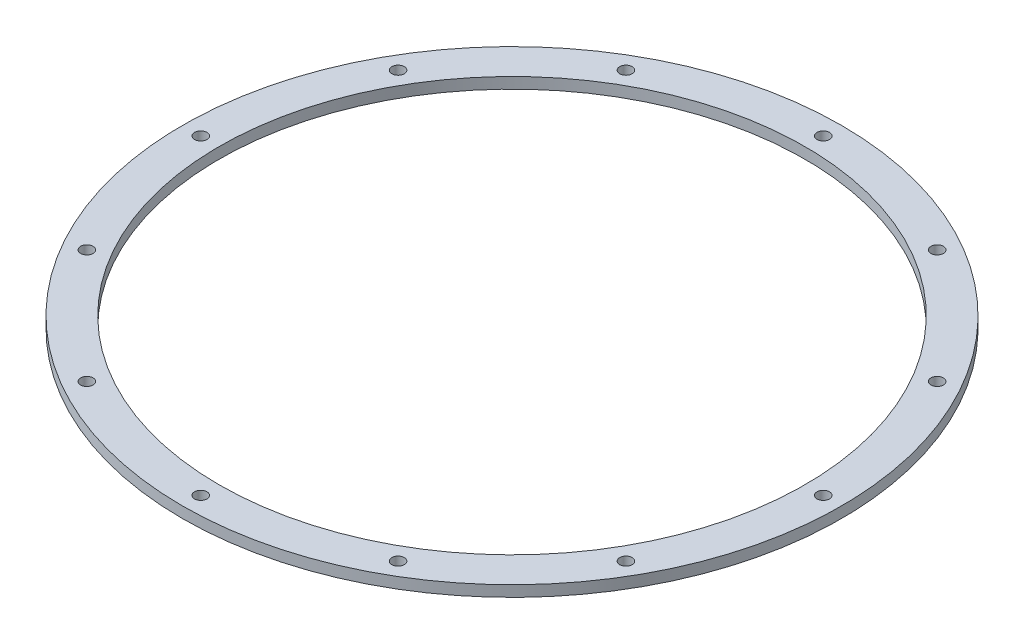
ISO-10303-21;
HEADER;
FILE_DESCRIPTION(('STEP AP214'),'2;1');
FILE_NAME('part.step','',(''),(''),'','','');
FILE_SCHEMA(('AUTOMOTIVE_DESIGN { 1 0 10303 214 1 1 1 1 }'));
ENDSEC;
DATA;
#1=APPLICATION_CONTEXT('core data for automotive mechanical design processes');
#2=APPLICATION_PROTOCOL_DEFINITION('international standard','automotive_design',2000,#1);
#3=PRODUCT_CONTEXT('',#1,'mechanical');
#4=PRODUCT('Part','Part','',(#3));
#5=PRODUCT_RELATED_PRODUCT_CATEGORY('part','',(#4));
#6=PRODUCT_DEFINITION_FORMATION('','',#4);
#7=PRODUCT_DEFINITION_CONTEXT('part definition',#1,'design');
#8=PRODUCT_DEFINITION('design','',#6,#7);
#9=PRODUCT_DEFINITION_SHAPE('','',#8);
#10=(LENGTH_UNIT() NAMED_UNIT(*) SI_UNIT(.MILLI.,.METRE.));
#11=(NAMED_UNIT(*) PLANE_ANGLE_UNIT() SI_UNIT($,.RADIAN.));
#12=(NAMED_UNIT(*) SI_UNIT($,.STERADIAN.) SOLID_ANGLE_UNIT());
#13=UNCERTAINTY_MEASURE_WITH_UNIT(LENGTH_MEASURE(1.E-05),#10,'distance_accuracy_value','');
#14=(GEOMETRIC_REPRESENTATION_CONTEXT(3) GLOBAL_UNCERTAINTY_ASSIGNED_CONTEXT((#13)) GLOBAL_UNIT_ASSIGNED_CONTEXT((#10,
#11,#12)) REPRESENTATION_CONTEXT('',''));
#15=CARTESIAN_POINT('',(0.,0.,0.));
#16=DIRECTION('',(0.,0.,1.));
#17=DIRECTION('',(1.,0.,0.));
#18=AXIS2_PLACEMENT_3D('',#15,#16,#17);
#19=CARTESIAN_POINT('',(0.,3.,0.));
#20=DIRECTION('',(0.,-1.,0.));
#21=DIRECTION('',(0.,0.,-1.));
#22=AXIS2_PLACEMENT_3D('',#19,#20,#21);
#23=CYLINDRICAL_SURFACE('',#22,80.);
#24=CARTESIAN_POINT('',(0.,3.,0.));
#25=DIRECTION('',(0.,1.,0.));
#26=DIRECTION('',(0.,0.,1.));
#27=AXIS2_PLACEMENT_3D('',#24,#25,#26);
#28=CIRCLE('',#27,80.);
#29=CARTESIAN_POINT('',(0.,3.,80.));
#30=VERTEX_POINT('',#29);
#31=EDGE_CURVE('E48',#30,#30,#28,.T.);
#32=ORIENTED_EDGE('',*,*,#31,.T.);
#33=EDGE_LOOP('',(#32));
#34=FACE_BOUND('',#33,.T.);
#35=CARTESIAN_POINT('',(0.,0.,0.));
#36=DIRECTION('',(0.,1.,0.));
#37=DIRECTION('',(0.,0.,1.));
#38=AXIS2_PLACEMENT_3D('',#35,#36,#37);
#39=CIRCLE('',#38,80.);
#40=CARTESIAN_POINT('',(0.,0.,80.));
#41=VERTEX_POINT('',#40);
#42=EDGE_CURVE('E105',#41,#41,#39,.T.);
#43=ORIENTED_EDGE('',*,*,#42,.F.);
#44=EDGE_LOOP('',(#43));
#45=FACE_BOUND('',#44,.T.);
#46=ADVANCED_FACE('F39',(#34,#45),#23,.F.);
#47=CARTESIAN_POINT('',(0.,3.,-85.));
#48=DIRECTION('',(0.,-1.,0.));
#49=DIRECTION('',(0.,0.,-1.));
#50=AXIS2_PLACEMENT_3D('',#47,#48,#49);
#51=CYLINDRICAL_SURFACE('',#50,1.7);
#52=CARTESIAN_POINT('',(0.,3.,-85.));
#53=DIRECTION('',(0.,1.,0.));
#54=DIRECTION('',(0.,0.,1.));
#55=AXIS2_PLACEMENT_3D('',#52,#53,#54);
#56=CIRCLE('',#55,1.7);
#57=CARTESIAN_POINT('',(0.,3.,-83.3));
#58=VERTEX_POINT('',#57);
#59=EDGE_CURVE('E54',#58,#58,#56,.T.);
#60=ORIENTED_EDGE('',*,*,#59,.T.);
#61=EDGE_LOOP('',(#60));
#62=FACE_BOUND('',#61,.T.);
#63=CARTESIAN_POINT('',(0.,0.,-85.));
#64=DIRECTION('',(0.,1.,0.));
#65=DIRECTION('',(0.,0.,1.));
#66=AXIS2_PLACEMENT_3D('',#63,#64,#65);
#67=CIRCLE('',#66,1.7);
#68=CARTESIAN_POINT('',(0.,0.,-83.3));
#69=VERTEX_POINT('',#68);
#70=EDGE_CURVE('E102',#69,#69,#67,.T.);
#71=ORIENTED_EDGE('',*,*,#70,.F.);
#72=EDGE_LOOP('',(#71));
#73=FACE_BOUND('',#72,.T.);
#74=ADVANCED_FACE('F164',(#62,#73),#51,.F.);
#75=CARTESIAN_POINT('',(42.5000000000001,3.,-73.6121593216773));
#76=DIRECTION('',(0.,-1.,0.));
#77=DIRECTION('',(0.,0.,-1.));
#78=AXIS2_PLACEMENT_3D('',#75,#76,#77);
#79=CYLINDRICAL_SURFACE('',#78,1.7);
#80=CARTESIAN_POINT('',(42.5000000000001,3.,-73.6121593216773));
#81=DIRECTION('',(0.,1.,0.));
#82=DIRECTION('',(0.,0.,1.));
#83=AXIS2_PLACEMENT_3D('',#80,#81,#82);
#84=CIRCLE('',#83,1.7);
#85=CARTESIAN_POINT('',(42.5000000000001,3.,-71.9121593216772));
#86=VERTEX_POINT('',#85);
#87=EDGE_CURVE('E157',#86,#86,#84,.T.);
#88=ORIENTED_EDGE('',*,*,#87,.T.);
#89=EDGE_LOOP('',(#88));
#90=FACE_BOUND('',#89,.T.);
#91=CARTESIAN_POINT('',(42.5000000000001,0.,-73.6121593216773));
#92=DIRECTION('',(0.,1.,0.));
#93=DIRECTION('',(0.,0.,1.));
#94=AXIS2_PLACEMENT_3D('',#91,#92,#93);
#95=CIRCLE('',#94,1.7);
#96=CARTESIAN_POINT('',(42.5000000000001,0.,-71.9121593216772));
#97=VERTEX_POINT('',#96);
#98=EDGE_CURVE('E98',#97,#97,#95,.T.);
#99=ORIENTED_EDGE('',*,*,#98,.F.);
#100=EDGE_LOOP('',(#99));
#101=FACE_BOUND('',#100,.T.);
#102=ADVANCED_FACE('F182',(#90,#101),#79,.F.);
#103=CARTESIAN_POINT('',(73.6121593216791,3.,-42.5000000000031));
#104=DIRECTION('',(0.,-1.,0.));
#105=DIRECTION('',(0.,0.,-1.));
#106=AXIS2_PLACEMENT_3D('',#103,#104,#105);
#107=CYLINDRICAL_SURFACE('',#106,1.70000000000101);
#108=CARTESIAN_POINT('',(73.6121593216791,3.,-42.5000000000031));
#109=DIRECTION('',(0.,1.,0.));
#110=DIRECTION('',(0.,0.,1.));
#111=AXIS2_PLACEMENT_3D('',#108,#109,#110);
#112=CIRCLE('',#111,1.70000000000101);
#113=CARTESIAN_POINT('',(73.6121593216791,3.,-40.8000000000021));
#114=VERTEX_POINT('',#113);
#115=EDGE_CURVE('E153',#114,#114,#112,.T.);
#116=ORIENTED_EDGE('',*,*,#115,.T.);
#117=EDGE_LOOP('',(#116));
#118=FACE_BOUND('',#117,.T.);
#119=CARTESIAN_POINT('',(73.6121593216791,0.,-42.5000000000031));
#120=DIRECTION('',(0.,1.,0.));
#121=DIRECTION('',(0.,0.,1.));
#122=AXIS2_PLACEMENT_3D('',#119,#120,#121);
#123=CIRCLE('',#122,1.70000000000101);
#124=CARTESIAN_POINT('',(73.6121593216791,0.,-40.8000000000021));
#125=VERTEX_POINT('',#124);
#126=EDGE_CURVE('E94',#125,#125,#123,.T.);
#127=ORIENTED_EDGE('',*,*,#126,.F.);
#128=EDGE_LOOP('',(#127));
#129=FACE_BOUND('',#128,.T.);
#130=ADVANCED_FACE('F189',(#118,#129),#107,.F.);
#131=CARTESIAN_POINT('',(85.0000000000036,3.,-3.60815370568738E-12));
#132=DIRECTION('',(0.,-1.,0.));
#133=DIRECTION('',(0.,0.,-1.));
#134=AXIS2_PLACEMENT_3D('',#131,#132,#133);
#135=CYLINDRICAL_SURFACE('',#134,1.70000000000269);
#136=CARTESIAN_POINT('',(85.0000000000036,3.,-3.60815370568738E-12));
#137=DIRECTION('',(0.,1.,0.));
#138=DIRECTION('',(0.,0.,1.));
#139=AXIS2_PLACEMENT_3D('',#136,#137,#138);
#140=CIRCLE('',#139,1.70000000000269);
#141=CARTESIAN_POINT('',(85.0000000000036,3.,1.69999999999908));
#142=VERTEX_POINT('',#141);
#143=EDGE_CURVE('E149',#142,#142,#140,.T.);
#144=ORIENTED_EDGE('',*,*,#143,.T.);
#145=EDGE_LOOP('',(#144));
#146=FACE_BOUND('',#145,.T.);
#147=CARTESIAN_POINT('',(85.0000000000036,0.,-3.60815370568738E-12));
#148=DIRECTION('',(0.,1.,0.));
#149=DIRECTION('',(0.,0.,1.));
#150=AXIS2_PLACEMENT_3D('',#147,#148,#149);
#151=CIRCLE('',#150,1.70000000000269);
#152=CARTESIAN_POINT('',(85.0000000000036,0.,1.69999999999908));
#153=VERTEX_POINT('',#152);
#154=EDGE_CURVE('E90',#153,#153,#151,.T.);
#155=ORIENTED_EDGE('',*,*,#154,.F.);
#156=EDGE_LOOP('',(#155));
#157=FACE_BOUND('',#156,.T.);
#158=ADVANCED_FACE('F193',(#146,#157),#135,.F.);
#159=CARTESIAN_POINT('',(73.6121593216827,3.,42.4999999999969));
#160=DIRECTION('',(0.,-1.,0.));
#161=DIRECTION('',(0.,0.,-1.));
#162=AXIS2_PLACEMENT_3D('',#159,#160,#161);
#163=CYLINDRICAL_SURFACE('',#162,1.70000000000466);
#164=CARTESIAN_POINT('',(73.6121593216827,3.,42.4999999999969));
#165=DIRECTION('',(0.,1.,0.));
#166=DIRECTION('',(0.,0.,1.));
#167=AXIS2_PLACEMENT_3D('',#164,#165,#166);
#168=CIRCLE('',#167,1.70000000000466);
#169=CARTESIAN_POINT('',(73.6121593216827,3.,44.2000000000015));
#170=VERTEX_POINT('',#169);
#171=EDGE_CURVE('E145',#170,#170,#168,.T.);
#172=ORIENTED_EDGE('',*,*,#171,.T.);
#173=EDGE_LOOP('',(#172));
#174=FACE_BOUND('',#173,.T.);
#175=CARTESIAN_POINT('',(73.6121593216827,0.,42.4999999999969));
#176=DIRECTION('',(0.,1.,0.));
#177=DIRECTION('',(0.,0.,1.));
#178=AXIS2_PLACEMENT_3D('',#175,#176,#177);
#179=CIRCLE('',#178,1.70000000000466);
#180=CARTESIAN_POINT('',(73.6121593216827,0.,44.2000000000015));
#181=VERTEX_POINT('',#180);
#182=EDGE_CURVE('E86',#181,#181,#179,.T.);
#183=ORIENTED_EDGE('',*,*,#182,.F.);
#184=EDGE_LOOP('',(#183));
#185=FACE_BOUND('',#184,.T.);
#186=ADVANCED_FACE('F197',(#174,#185),#163,.F.);
#187=CARTESIAN_POINT('',(42.5000000000068,3.,73.6121593216755));
#188=DIRECTION('',(0.,-1.,0.));
#189=DIRECTION('',(0.,0.,-1.));
#190=AXIS2_PLACEMENT_3D('',#187,#188,#189);
#191=CYLINDRICAL_SURFACE('',#190,1.70000000000642);
#192=CARTESIAN_POINT('',(42.5000000000068,3.,73.6121593216755));
#193=DIRECTION('',(0.,1.,0.));
#194=DIRECTION('',(0.,0.,1.));
#195=AXIS2_PLACEMENT_3D('',#192,#193,#194);
#196=CIRCLE('',#195,1.70000000000642);
#197=CARTESIAN_POINT('',(42.5000000000068,3.,75.3121593216819));
#198=VERTEX_POINT('',#197);
#199=EDGE_CURVE('E141',#198,#198,#196,.T.);
#200=ORIENTED_EDGE('',*,*,#199,.T.);
#201=EDGE_LOOP('',(#200));
#202=FACE_BOUND('',#201,.T.);
#203=CARTESIAN_POINT('',(42.5000000000068,0.,73.6121593216755));
#204=DIRECTION('',(0.,1.,0.));
#205=DIRECTION('',(0.,0.,1.));
#206=AXIS2_PLACEMENT_3D('',#203,#204,#205);
#207=CIRCLE('',#206,1.70000000000642);
#208=CARTESIAN_POINT('',(42.5000000000068,0.,75.3121593216819));
#209=VERTEX_POINT('',#208);
#210=EDGE_CURVE('E82',#209,#209,#207,.T.);
#211=ORIENTED_EDGE('',*,*,#210,.F.);
#212=EDGE_LOOP('',(#211));
#213=FACE_BOUND('',#212,.T.);
#214=ADVANCED_FACE('F201',(#202,#213),#191,.F.);
#215=CARTESIAN_POINT('',(7.21630741137477E-12,3.,85.));
#216=DIRECTION('',(0.,-1.,0.));
#217=DIRECTION('',(0.,0.,-1.));
#218=AXIS2_PLACEMENT_3D('',#215,#216,#217);
#219=CYLINDRICAL_SURFACE('',#218,1.70000000000747);
#220=CARTESIAN_POINT('',(7.21630741137477E-12,3.,85.));
#221=DIRECTION('',(0.,1.,0.));
#222=DIRECTION('',(0.,0.,1.));
#223=AXIS2_PLACEMENT_3D('',#220,#221,#222);
#224=CIRCLE('',#223,1.70000000000747);
#225=CARTESIAN_POINT('',(7.21630741137477E-12,3.,86.7000000000075));
#226=VERTEX_POINT('',#225);
#227=EDGE_CURVE('E137',#226,#226,#224,.T.);
#228=ORIENTED_EDGE('',*,*,#227,.T.);
#229=EDGE_LOOP('',(#228));
#230=FACE_BOUND('',#229,.T.);
#231=CARTESIAN_POINT('',(7.21630741137477E-12,0.,85.));
#232=DIRECTION('',(0.,1.,0.));
#233=DIRECTION('',(0.,0.,1.));
#234=AXIS2_PLACEMENT_3D('',#231,#232,#233);
#235=CIRCLE('',#234,1.70000000000747);
#236=CARTESIAN_POINT('',(7.21630741137477E-12,0.,86.7000000000075));
#237=VERTEX_POINT('',#236);
#238=EDGE_CURVE('E78',#237,#237,#235,.T.);
#239=ORIENTED_EDGE('',*,*,#238,.F.);
#240=EDGE_LOOP('',(#239));
#241=FACE_BOUND('',#240,.T.);
#242=ADVANCED_FACE('F205',(#230,#241),#219,.F.);
#243=CARTESIAN_POINT('',(-42.4999999999933,3.,73.6121593216791));
#244=DIRECTION('',(0.,-1.,0.));
#245=DIRECTION('',(0.,0.,-1.));
#246=AXIS2_PLACEMENT_3D('',#243,#244,#245);
#247=CYLINDRICAL_SURFACE('',#246,1.70000000000766);
#248=CARTESIAN_POINT('',(-42.4999999999933,3.,73.6121593216791));
#249=DIRECTION('',(0.,1.,0.));
#250=DIRECTION('',(0.,0.,1.));
#251=AXIS2_PLACEMENT_3D('',#248,#249,#250);
#252=CIRCLE('',#251,1.70000000000766);
#253=CARTESIAN_POINT('',(-42.4999999999933,3.,75.3121593216868));
#254=VERTEX_POINT('',#253);
#255=EDGE_CURVE('E133',#254,#254,#252,.T.);
#256=ORIENTED_EDGE('',*,*,#255,.T.);
#257=EDGE_LOOP('',(#256));
#258=FACE_BOUND('',#257,.T.);
#259=CARTESIAN_POINT('',(-42.4999999999933,0.,73.6121593216791));
#260=DIRECTION('',(0.,1.,0.));
#261=DIRECTION('',(0.,0.,1.));
#262=AXIS2_PLACEMENT_3D('',#259,#260,#261);
#263=CIRCLE('',#262,1.70000000000766);
#264=CARTESIAN_POINT('',(-42.4999999999933,0.,75.3121593216868));
#265=VERTEX_POINT('',#264);
#266=EDGE_CURVE('E74',#265,#265,#263,.T.);
#267=ORIENTED_EDGE('',*,*,#266,.F.);
#268=EDGE_LOOP('',(#267));
#269=FACE_BOUND('',#268,.T.);
#270=ADVANCED_FACE('F209',(#258,#269),#247,.F.);
#271=CARTESIAN_POINT('',(-73.6121593216719,3.,42.5000000000032));
#272=DIRECTION('',(0.,-1.,0.));
#273=DIRECTION('',(0.,0.,-1.));
#274=AXIS2_PLACEMENT_3D('',#271,#272,#273);
#275=CYLINDRICAL_SURFACE('',#274,1.70000000000687);
#276=CARTESIAN_POINT('',(-73.6121593216719,3.,42.5000000000032));
#277=DIRECTION('',(0.,1.,0.));
#278=DIRECTION('',(0.,0.,1.));
#279=AXIS2_PLACEMENT_3D('',#276,#277,#278);
#280=CIRCLE('',#279,1.70000000000687);
#281=CARTESIAN_POINT('',(-73.6121593216719,3.,44.20000000001));
#282=VERTEX_POINT('',#281);
#283=EDGE_CURVE('E129',#282,#282,#280,.T.);
#284=ORIENTED_EDGE('',*,*,#283,.T.);
#285=EDGE_LOOP('',(#284));
#286=FACE_BOUND('',#285,.T.);
#287=CARTESIAN_POINT('',(-73.6121593216719,0.,42.5000000000032));
#288=DIRECTION('',(0.,1.,0.));
#289=DIRECTION('',(0.,0.,1.));
#290=AXIS2_PLACEMENT_3D('',#287,#288,#289);
#291=CIRCLE('',#290,1.70000000000687);
#292=CARTESIAN_POINT('',(-73.6121593216719,0.,44.20000000001));
#293=VERTEX_POINT('',#292);
#294=EDGE_CURVE('E70',#293,#293,#291,.T.);
#295=ORIENTED_EDGE('',*,*,#294,.F.);
#296=EDGE_LOOP('',(#295));
#297=FACE_BOUND('',#296,.T.);
#298=ADVANCED_FACE('F213',(#286,#297),#275,.F.);
#299=CARTESIAN_POINT('',(-84.9999999999964,3.,3.61856320348014E-12));
#300=DIRECTION('',(0.,-1.,0.));
#301=DIRECTION('',(0.,0.,-1.));
#302=AXIS2_PLACEMENT_3D('',#299,#300,#301);
#303=CYLINDRICAL_SURFACE('',#302,1.70000000000537);
#304=CARTESIAN_POINT('',(-84.9999999999964,3.,3.61856320348014E-12));
#305=DIRECTION('',(0.,1.,0.));
#306=DIRECTION('',(0.,0.,1.));
#307=AXIS2_PLACEMENT_3D('',#304,#305,#306);
#308=CIRCLE('',#307,1.70000000000537);
#309=CARTESIAN_POINT('',(-84.9999999999964,3.,1.70000000000899));
#310=VERTEX_POINT('',#309);
#311=EDGE_CURVE('E123',#310,#310,#308,.T.);
#312=ORIENTED_EDGE('',*,*,#311,.T.);
#313=EDGE_LOOP('',(#312));
#314=FACE_BOUND('',#313,.T.);
#315=CARTESIAN_POINT('',(-84.9999999999964,0.,3.61856320348014E-12));
#316=DIRECTION('',(0.,1.,0.));
#317=DIRECTION('',(0.,0.,1.));
#318=AXIS2_PLACEMENT_3D('',#315,#316,#317);
#319=CIRCLE('',#318,1.70000000000537);
#320=CARTESIAN_POINT('',(-84.9999999999964,0.,1.70000000000899));
#321=VERTEX_POINT('',#320);
#322=EDGE_CURVE('E66',#321,#321,#319,.T.);
#323=ORIENTED_EDGE('',*,*,#322,.F.);
#324=EDGE_LOOP('',(#323));
#325=FACE_BOUND('',#324,.T.);
#326=ADVANCED_FACE('F217',(#314,#325),#303,.F.);
#327=CARTESIAN_POINT('',(-73.6121593216755,3.,-42.4999999999968));
#328=DIRECTION('',(0.,-1.,0.));
#329=DIRECTION('',(0.,0.,-1.));
#330=AXIS2_PLACEMENT_3D('',#327,#328,#329);
#331=CYLINDRICAL_SURFACE('',#330,1.70000000000365);
#332=CARTESIAN_POINT('',(-73.6121593216755,3.,-42.4999999999968));
#333=DIRECTION('',(0.,1.,0.));
#334=DIRECTION('',(0.,0.,1.));
#335=AXIS2_PLACEMENT_3D('',#332,#333,#334);
#336=CIRCLE('',#335,1.70000000000365);
#337=CARTESIAN_POINT('',(-73.6121593216755,3.,-40.7999999999932));
#338=VERTEX_POINT('',#337);
#339=EDGE_CURVE('E117',#338,#338,#336,.T.);
#340=ORIENTED_EDGE('',*,*,#339,.T.);
#341=EDGE_LOOP('',(#340));
#342=FACE_BOUND('',#341,.T.);
#343=CARTESIAN_POINT('',(-73.6121593216755,0.,-42.4999999999968));
#344=DIRECTION('',(0.,1.,0.));
#345=DIRECTION('',(0.,0.,1.));
#346=AXIS2_PLACEMENT_3D('',#343,#344,#345);
#347=CIRCLE('',#346,1.70000000000365);
#348=CARTESIAN_POINT('',(-73.6121593216755,0.,-40.7999999999932));
#349=VERTEX_POINT('',#348);
#350=EDGE_CURVE('E62',#349,#349,#347,.T.);
#351=ORIENTED_EDGE('',*,*,#350,.F.);
#352=EDGE_LOOP('',(#351));
#353=FACE_BOUND('',#352,.T.);
#354=ADVANCED_FACE('F220',(#342,#353),#331,.F.);
#355=CARTESIAN_POINT('',(-42.4999999999996,3.,-73.6121593216755));
#356=DIRECTION('',(0.,-1.,0.));
#357=DIRECTION('',(0.,0.,-1.));
#358=AXIS2_PLACEMENT_3D('',#355,#356,#357);
#359=CYLINDRICAL_SURFACE('',#358,1.70000000000208);
#360=CARTESIAN_POINT('',(-42.4999999999996,3.,-73.6121593216755));
#361=DIRECTION('',(0.,1.,0.));
#362=DIRECTION('',(0.,0.,1.));
#363=AXIS2_PLACEMENT_3D('',#360,#361,#362);
#364=CIRCLE('',#363,1.70000000000208);
#365=CARTESIAN_POINT('',(-42.4999999999996,3.,-71.9121593216734));
#366=VERTEX_POINT('',#365);
#367=EDGE_CURVE('E112',#366,#366,#364,.T.);
#368=ORIENTED_EDGE('',*,*,#367,.T.);
#369=EDGE_LOOP('',(#368));
#370=FACE_BOUND('',#369,.T.);
#371=CARTESIAN_POINT('',(-42.4999999999996,0.,-73.6121593216755));
#372=DIRECTION('',(0.,1.,0.));
#373=DIRECTION('',(0.,0.,1.));
#374=AXIS2_PLACEMENT_3D('',#371,#372,#373);
#375=CIRCLE('',#374,1.70000000000208);
#376=CARTESIAN_POINT('',(-42.4999999999996,0.,-71.9121593216734));
#377=VERTEX_POINT('',#376);
#378=EDGE_CURVE('E58',#377,#377,#375,.T.);
#379=ORIENTED_EDGE('',*,*,#378,.F.);
#380=EDGE_LOOP('',(#379));
#381=FACE_BOUND('',#380,.T.);
#382=ADVANCED_FACE('F41',(#370,#381),#359,.F.);
#383=CARTESIAN_POINT('',(0.,3.,0.));
#384=DIRECTION('',(0.,-1.,0.));
#385=DIRECTION('',(0.,0.,-1.));
#386=AXIS2_PLACEMENT_3D('',#383,#384,#385);
#387=CYLINDRICAL_SURFACE('',#386,90.);
#388=CARTESIAN_POINT('',(0.,3.,0.));
#389=DIRECTION('',(0.,1.,0.));
#390=DIRECTION('',(0.,0.,1.));
#391=AXIS2_PLACEMENT_3D('',#388,#389,#390);
#392=CIRCLE('',#391,90.);
#393=CARTESIAN_POINT('',(0.,3.,90.));
#394=VERTEX_POINT('',#393);
#395=EDGE_CURVE('E10',#394,#394,#392,.T.);
#396=ORIENTED_EDGE('',*,*,#395,.F.);
#397=EDGE_LOOP('',(#396));
#398=FACE_BOUND('',#397,.T.);
#399=CARTESIAN_POINT('',(0.,0.,0.));
#400=DIRECTION('',(0.,1.,0.));
#401=DIRECTION('',(0.,0.,1.));
#402=AXIS2_PLACEMENT_3D('',#399,#400,#401);
#403=CIRCLE('',#402,90.);
#404=CARTESIAN_POINT('',(0.,0.,90.));
#405=VERTEX_POINT('',#404);
#406=EDGE_CURVE('E43',#405,#405,#403,.T.);
#407=ORIENTED_EDGE('',*,*,#406,.T.);
#408=EDGE_LOOP('',(#407));
#409=FACE_BOUND('',#408,.T.);
#410=ADVANCED_FACE('F171',(#398,#409),#387,.T.);
#411=CARTESIAN_POINT('',(0.,3.,0.));
#412=DIRECTION('',(0.,1.,0.));
#413=DIRECTION('',(0.,0.,1.));
#414=AXIS2_PLACEMENT_3D('',#411,#412,#413);
#415=PLANE('',#414);
#416=ORIENTED_EDGE('',*,*,#367,.F.);
#417=EDGE_LOOP('',(#416));
#418=FACE_BOUND('',#417,.T.);
#419=ORIENTED_EDGE('',*,*,#339,.F.);
#420=EDGE_LOOP('',(#419));
#421=FACE_BOUND('',#420,.T.);
#422=ORIENTED_EDGE('',*,*,#311,.F.);
#423=EDGE_LOOP('',(#422));
#424=FACE_BOUND('',#423,.T.);
#425=ORIENTED_EDGE('',*,*,#283,.F.);
#426=EDGE_LOOP('',(#425));
#427=FACE_BOUND('',#426,.T.);
#428=ORIENTED_EDGE('',*,*,#255,.F.);
#429=EDGE_LOOP('',(#428));
#430=FACE_BOUND('',#429,.T.);
#431=ORIENTED_EDGE('',*,*,#227,.F.);
#432=EDGE_LOOP('',(#431));
#433=FACE_BOUND('',#432,.T.);
#434=ORIENTED_EDGE('',*,*,#199,.F.);
#435=EDGE_LOOP('',(#434));
#436=FACE_BOUND('',#435,.T.);
#437=ORIENTED_EDGE('',*,*,#171,.F.);
#438=EDGE_LOOP('',(#437));
#439=FACE_BOUND('',#438,.T.);
#440=ORIENTED_EDGE('',*,*,#143,.F.);
#441=EDGE_LOOP('',(#440));
#442=FACE_BOUND('',#441,.T.);
#443=ORIENTED_EDGE('',*,*,#115,.F.);
#444=EDGE_LOOP('',(#443));
#445=FACE_BOUND('',#444,.T.);
#446=ORIENTED_EDGE('',*,*,#87,.F.);
#447=EDGE_LOOP('',(#446));
#448=FACE_BOUND('',#447,.T.);
#449=ORIENTED_EDGE('',*,*,#59,.F.);
#450=EDGE_LOOP('',(#449));
#451=FACE_BOUND('',#450,.T.);
#452=ORIENTED_EDGE('',*,*,#31,.F.);
#453=EDGE_LOOP('',(#452));
#454=FACE_BOUND('',#453,.T.);
#455=ORIENTED_EDGE('',*,*,#395,.T.);
#456=EDGE_LOOP('',(#455));
#457=FACE_BOUND('',#456,.T.);
#458=ADVANCED_FACE('F167',(#418,#421,#424,#427,#430,#433,#436,#439,#442,#445,#448,#451,#454,
#457),#415,.T.);
#459=CARTESIAN_POINT('',(0.,0.,0.));
#460=DIRECTION('',(0.,1.,0.));
#461=DIRECTION('',(0.,0.,1.));
#462=AXIS2_PLACEMENT_3D('',#459,#460,#461);
#463=PLANE('',#462);
#464=ORIENTED_EDGE('',*,*,#378,.T.);
#465=EDGE_LOOP('',(#464));
#466=FACE_BOUND('',#465,.T.);
#467=ORIENTED_EDGE('',*,*,#350,.T.);
#468=EDGE_LOOP('',(#467));
#469=FACE_BOUND('',#468,.T.);
#470=ORIENTED_EDGE('',*,*,#322,.T.);
#471=EDGE_LOOP('',(#470));
#472=FACE_BOUND('',#471,.T.);
#473=ORIENTED_EDGE('',*,*,#294,.T.);
#474=EDGE_LOOP('',(#473));
#475=FACE_BOUND('',#474,.T.);
#476=ORIENTED_EDGE('',*,*,#266,.T.);
#477=EDGE_LOOP('',(#476));
#478=FACE_BOUND('',#477,.T.);
#479=ORIENTED_EDGE('',*,*,#238,.T.);
#480=EDGE_LOOP('',(#479));
#481=FACE_BOUND('',#480,.T.);
#482=ORIENTED_EDGE('',*,*,#210,.T.);
#483=EDGE_LOOP('',(#482));
#484=FACE_BOUND('',#483,.T.);
#485=ORIENTED_EDGE('',*,*,#182,.T.);
#486=EDGE_LOOP('',(#485));
#487=FACE_BOUND('',#486,.T.);
#488=ORIENTED_EDGE('',*,*,#154,.T.);
#489=EDGE_LOOP('',(#488));
#490=FACE_BOUND('',#489,.T.);
#491=ORIENTED_EDGE('',*,*,#126,.T.);
#492=EDGE_LOOP('',(#491));
#493=FACE_BOUND('',#492,.T.);
#494=ORIENTED_EDGE('',*,*,#98,.T.);
#495=EDGE_LOOP('',(#494));
#496=FACE_BOUND('',#495,.T.);
#497=ORIENTED_EDGE('',*,*,#70,.T.);
#498=EDGE_LOOP('',(#497));
#499=FACE_BOUND('',#498,.T.);
#500=ORIENTED_EDGE('',*,*,#42,.T.);
#501=EDGE_LOOP('',(#500));
#502=FACE_BOUND('',#501,.T.);
#503=ORIENTED_EDGE('',*,*,#406,.F.);
#504=EDGE_LOOP('',(#503));
#505=FACE_BOUND('',#504,.T.);
#506=ADVANCED_FACE('F170',(#466,#469,#472,#475,#478,#481,#484,#487,#490,#493,#496,#499,#502,
#505),#463,.F.);
#507=CLOSED_SHELL('',(#46,#74,#102,#130,#158,#186,#214,#242,#270,#298,#326,#354,#382,#410,#458,#506));
#508=MANIFOLD_SOLID_BREP('B2',#507);
#509=ADVANCED_BREP_SHAPE_REPRESENTATION('',(#18,#508),#14);
#510=SHAPE_DEFINITION_REPRESENTATION(#9,#509);
ENDSEC;
END-ISO-10303-21;
